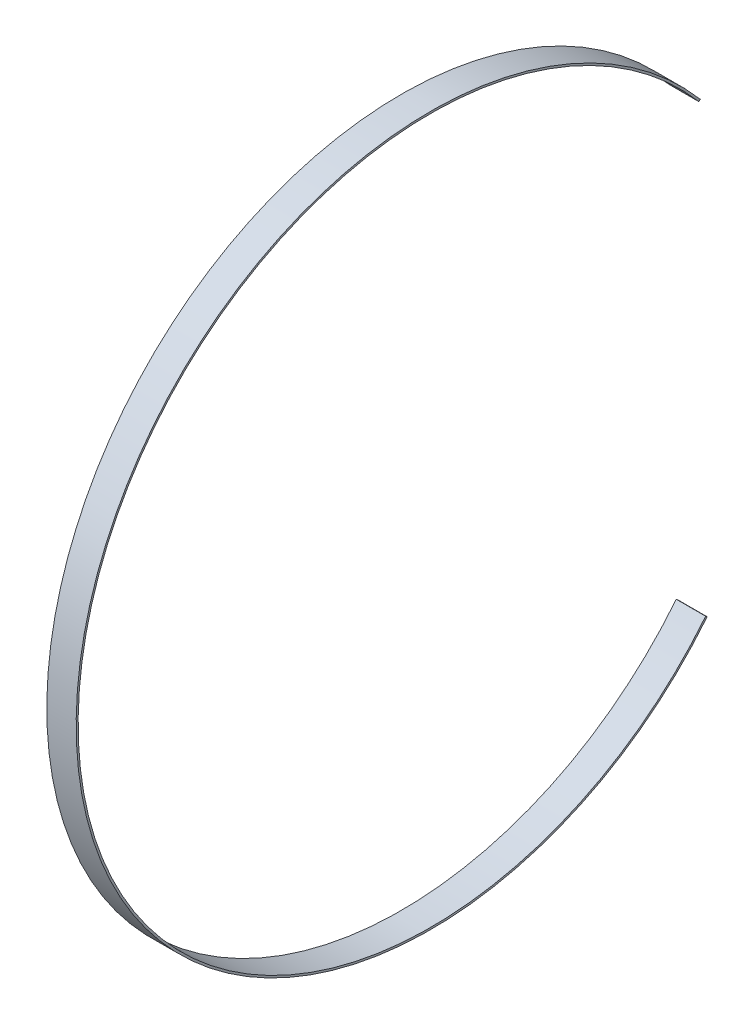
ISO-10303-21;
HEADER;
FILE_DESCRIPTION(('STEP AP214'),'2;1');
FILE_NAME('part.step','',(''),(''),'','','');
FILE_SCHEMA(('AUTOMOTIVE_DESIGN { 1 0 10303 214 1 1 1 1 }'));
ENDSEC;
DATA;
#1=APPLICATION_CONTEXT('core data for automotive mechanical design processes');
#2=APPLICATION_PROTOCOL_DEFINITION('international standard','automotive_design',2000,#1);
#3=PRODUCT_CONTEXT('',#1,'mechanical');
#4=PRODUCT('Part','Part','',(#3));
#5=PRODUCT_RELATED_PRODUCT_CATEGORY('part','',(#4));
#6=PRODUCT_DEFINITION_FORMATION('','',#4);
#7=PRODUCT_DEFINITION_CONTEXT('part definition',#1,'design');
#8=PRODUCT_DEFINITION('design','',#6,#7);
#9=PRODUCT_DEFINITION_SHAPE('','',#8);
#10=(LENGTH_UNIT() NAMED_UNIT(*) SI_UNIT(.MILLI.,.METRE.));
#11=(NAMED_UNIT(*) PLANE_ANGLE_UNIT() SI_UNIT($,.RADIAN.));
#12=(NAMED_UNIT(*) SI_UNIT($,.STERADIAN.) SOLID_ANGLE_UNIT());
#13=UNCERTAINTY_MEASURE_WITH_UNIT(LENGTH_MEASURE(1.E-05),#10,'distance_accuracy_value','');
#14=(GEOMETRIC_REPRESENTATION_CONTEXT(3) GLOBAL_UNCERTAINTY_ASSIGNED_CONTEXT((#13)) GLOBAL_UNIT_ASSIGNED_CONTEXT((#10,
#11,#12)) REPRESENTATION_CONTEXT('',''));
#15=CARTESIAN_POINT('',(0.,0.,0.));
#16=DIRECTION('',(0.,0.,1.));
#17=DIRECTION('',(1.,0.,0.));
#18=AXIS2_PLACEMENT_3D('',#15,#16,#17);
#19=CARTESIAN_POINT('',(38.1,0.,0.));
#20=DIRECTION('',(-1.,0.,0.));
#21=DIRECTION('',(0.,0.,1.));
#22=AXIS2_PLACEMENT_3D('',#19,#20,#21);
#23=CYLINDRICAL_SURFACE('',#22,459.74);
#24=CARTESIAN_POINT('',(0.,0.,0.));
#25=DIRECTION('',(1.,0.,0.));
#26=DIRECTION('',(0.,0.,-1.));
#27=AXIS2_PLACEMENT_3D('',#24,#25,#26);
#28=CIRCLE('',#27,459.74);
#29=CARTESIAN_POINT('',(0.,298.25117010053,-349.867270738011));
#30=VERTEX_POINT('',#29);
#31=CARTESIAN_POINT('',(0.,-287.507180404035,-358.748503573356));
#32=VERTEX_POINT('',#31);
#33=EDGE_CURVE('E96',#30,#32,#28,.T.);
#34=ORIENTED_EDGE('',*,*,#33,.T.);
#35=DIRECTION('',(-1.,0.,0.));
#36=VECTOR('',#35,1.);
#37=CARTESIAN_POINT('',(38.1,-287.507180404035,-358.748503573356));
#38=LINE('',#37,#36);
#39=CARTESIAN_POINT('',(38.1,-287.507180404035,-358.748503573356));
#40=VERTEX_POINT('',#39);
#41=EDGE_CURVE('E11',#40,#32,#38,.T.);
#42=ORIENTED_EDGE('',*,*,#41,.F.);
#43=CARTESIAN_POINT('',(38.1,0.,0.));
#44=DIRECTION('',(1.,0.,0.));
#45=DIRECTION('',(0.,0.,-1.));
#46=AXIS2_PLACEMENT_3D('',#43,#44,#45);
#47=CIRCLE('',#46,459.74);
#48=CARTESIAN_POINT('',(38.1,298.25117010053,-349.867270738011));
#49=VERTEX_POINT('',#48);
#50=EDGE_CURVE('E73',#49,#40,#47,.T.);
#51=ORIENTED_EDGE('',*,*,#50,.F.);
#52=DIRECTION('',(-1.,0.,0.));
#53=VECTOR('',#52,1.);
#54=CARTESIAN_POINT('',(38.1,298.25117010053,-349.867270738011));
#55=LINE('',#54,#53);
#56=EDGE_CURVE('E49',#49,#30,#55,.T.);
#57=ORIENTED_EDGE('',*,*,#56,.T.);
#58=EDGE_LOOP('',(#34,#42,#51,#57));
#59=FACE_BOUND('',#58,.T.);
#60=ADVANCED_FACE('F33',(#59),#23,.T.);
#61=CARTESIAN_POINT('',(38.1,-285.918742943239,-356.766467642011));
#62=DIRECTION('',(0.,0.780329106828541,-0.62536907905346));
#63=DIRECTION('',(0.,0.62536907905346,0.780329106828541));
#64=AXIS2_PLACEMENT_3D('',#61,#62,#63);
#65=PLANE('',#64);
#66=DIRECTION('',(0.,-0.62536907905346,-0.780329106828541));
#67=VECTOR('',#66,1.);
#68=CARTESIAN_POINT('',(0.,-285.918742943239,-356.766467642011));
#69=LINE('',#68,#67);
#70=CARTESIAN_POINT('',(0.,-285.918742943239,-356.766467642011));
#71=VERTEX_POINT('',#70);
#72=EDGE_CURVE('E82',#71,#32,#69,.T.);
#73=ORIENTED_EDGE('',*,*,#72,.F.);
#74=DIRECTION('',(-1.,0.,0.));
#75=VECTOR('',#74,1.);
#76=CARTESIAN_POINT('',(38.1,-285.918742943239,-356.766467642011));
#77=LINE('',#76,#75);
#78=CARTESIAN_POINT('',(38.1,-285.918742943239,-356.766467642011));
#79=VERTEX_POINT('',#78);
#80=EDGE_CURVE('E41',#79,#71,#77,.T.);
#81=ORIENTED_EDGE('',*,*,#80,.F.);
#82=DIRECTION('',(0.,-0.62536907905346,-0.780329106828541));
#83=VECTOR('',#82,1.);
#84=CARTESIAN_POINT('',(38.1,-285.918742943239,-356.766467642011));
#85=LINE('',#84,#83);
#86=EDGE_CURVE('E80',#79,#40,#85,.T.);
#87=ORIENTED_EDGE('',*,*,#86,.T.);
#88=ORIENTED_EDGE('',*,*,#41,.T.);
#89=EDGE_LOOP('',(#73,#81,#87,#88));
#90=FACE_BOUND('',#89,.T.);
#91=ADVANCED_FACE('F79',(#90),#65,.T.);
#92=CARTESIAN_POINT('',(38.1,0.,0.));
#93=DIRECTION('',(-1.,0.,0.));
#94=DIRECTION('',(0.,0.,1.));
#95=AXIS2_PLACEMENT_3D('',#92,#93,#94);
#96=CYLINDRICAL_SURFACE('',#95,457.2);
#97=CARTESIAN_POINT('',(0.,0.,0.));
#98=DIRECTION('',(1.,0.,0.));
#99=DIRECTION('',(0.,0.,-1.));
#100=AXIS2_PLACEMENT_3D('',#97,#98,#99);
#101=CIRCLE('',#100,457.2);
#102=CARTESIAN_POINT('',(0.,296.603373580637,-347.934302391392));
#103=VERTEX_POINT('',#102);
#104=EDGE_CURVE('E99',#103,#71,#101,.T.);
#105=ORIENTED_EDGE('',*,*,#104,.F.);
#106=DIRECTION('',(-1.,0.,0.));
#107=VECTOR('',#106,1.);
#108=CARTESIAN_POINT('',(38.1,296.603373580637,-347.934302391392));
#109=LINE('',#108,#107);
#110=CARTESIAN_POINT('',(38.1,296.603373580637,-347.934302391392));
#111=VERTEX_POINT('',#110);
#112=EDGE_CURVE('E62',#111,#103,#109,.T.);
#113=ORIENTED_EDGE('',*,*,#112,.F.);
#114=CARTESIAN_POINT('',(38.1,0.,0.));
#115=DIRECTION('',(1.,0.,0.));
#116=DIRECTION('',(0.,0.,-1.));
#117=AXIS2_PLACEMENT_3D('',#114,#115,#116);
#118=CIRCLE('',#117,457.2);
#119=EDGE_CURVE('E88',#111,#79,#118,.T.);
#120=ORIENTED_EDGE('',*,*,#119,.T.);
#121=ORIENTED_EDGE('',*,*,#80,.T.);
#122=EDGE_LOOP('',(#105,#113,#120,#121));
#123=FACE_BOUND('',#122,.T.);
#124=ADVANCED_FACE('F90',(#123),#96,.F.);
#125=CARTESIAN_POINT('',(38.1,298.25117010053,-349.867270738011));
#126=DIRECTION('',(0.,-0.761011160086154,-0.648738787359231));
#127=DIRECTION('',(0.,0.648738787359231,-0.761011160086154));
#128=AXIS2_PLACEMENT_3D('',#125,#126,#127);
#129=PLANE('',#128);
#130=DIRECTION('',(0.,-0.648738787359231,0.761011160086154));
#131=VECTOR('',#130,1.);
#132=CARTESIAN_POINT('',(0.,298.25117010053,-349.867270738011));
#133=LINE('',#132,#131);
#134=EDGE_CURVE('E101',#30,#103,#133,.T.);
#135=ORIENTED_EDGE('',*,*,#134,.F.);
#136=ORIENTED_EDGE('',*,*,#56,.F.);
#137=DIRECTION('',(0.,-0.648738787359231,0.761011160086154));
#138=VECTOR('',#137,1.);
#139=CARTESIAN_POINT('',(38.1,298.25117010053,-349.867270738011));
#140=LINE('',#139,#138);
#141=EDGE_CURVE('E91',#49,#111,#140,.T.);
#142=ORIENTED_EDGE('',*,*,#141,.T.);
#143=ORIENTED_EDGE('',*,*,#112,.T.);
#144=EDGE_LOOP('',(#135,#136,#142,#143));
#145=FACE_BOUND('',#144,.T.);
#146=ADVANCED_FACE('F107',(#145),#129,.T.);
#147=CARTESIAN_POINT('',(38.1,0.,0.));
#148=DIRECTION('',(1.,0.,0.));
#149=DIRECTION('',(0.,0.,-1.));
#150=AXIS2_PLACEMENT_3D('',#147,#148,#149);
#151=PLANE('',#150);
#152=ORIENTED_EDGE('',*,*,#50,.T.);
#153=ORIENTED_EDGE('',*,*,#86,.F.);
#154=ORIENTED_EDGE('',*,*,#119,.F.);
#155=ORIENTED_EDGE('',*,*,#141,.F.);
#156=EDGE_LOOP('',(#152,#153,#154,#155));
#157=FACE_BOUND('',#156,.T.);
#158=ADVANCED_FACE('F87',(#157),#151,.T.);
#159=CARTESIAN_POINT('',(0.,0.,0.));
#160=DIRECTION('',(1.,0.,0.));
#161=DIRECTION('',(0.,0.,-1.));
#162=AXIS2_PLACEMENT_3D('',#159,#160,#161);
#163=PLANE('',#162);
#164=ORIENTED_EDGE('',*,*,#33,.F.);
#165=ORIENTED_EDGE('',*,*,#134,.T.);
#166=ORIENTED_EDGE('',*,*,#104,.T.);
#167=ORIENTED_EDGE('',*,*,#72,.T.);
#168=EDGE_LOOP('',(#164,#165,#166,#167));
#169=FACE_BOUND('',#168,.T.);
#170=ADVANCED_FACE('F106',(#169),#163,.F.);
#171=CLOSED_SHELL('',(#60,#91,#124,#146,#158,#170));
#172=MANIFOLD_SOLID_BREP('B2',#171);
#173=ADVANCED_BREP_SHAPE_REPRESENTATION('',(#18,#172),#14);
#174=SHAPE_DEFINITION_REPRESENTATION(#9,#173);
ENDSEC;
END-ISO-10303-21;
